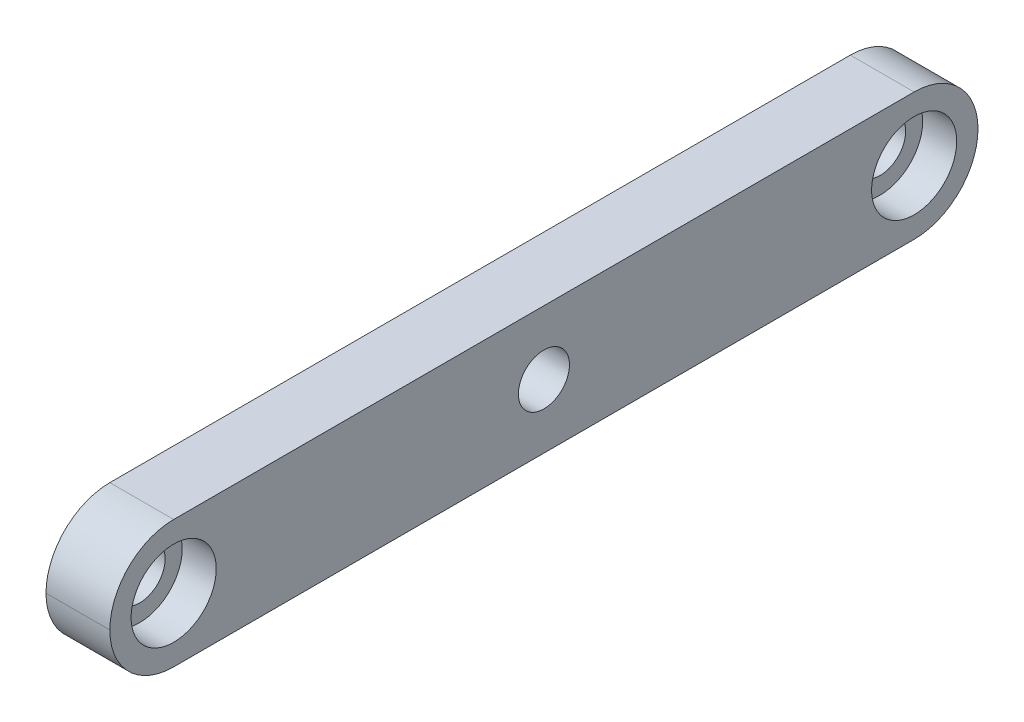
ISO-10303-21;
HEADER;
FILE_DESCRIPTION(('STEP AP214'),'2;1');
FILE_NAME('part.step','',(''),(''),'','','');
FILE_SCHEMA(('AUTOMOTIVE_DESIGN { 1 0 10303 214 1 1 1 1 }'));
ENDSEC;
DATA;
#1=APPLICATION_CONTEXT('core data for automotive mechanical design processes');
#2=APPLICATION_PROTOCOL_DEFINITION('international standard','automotive_design',2000,#1);
#3=PRODUCT_CONTEXT('',#1,'mechanical');
#4=PRODUCT('Part','Part','',(#3));
#5=PRODUCT_RELATED_PRODUCT_CATEGORY('part','',(#4));
#6=PRODUCT_DEFINITION_FORMATION('','',#4);
#7=PRODUCT_DEFINITION_CONTEXT('part definition',#1,'design');
#8=PRODUCT_DEFINITION('design','',#6,#7);
#9=PRODUCT_DEFINITION_SHAPE('','',#8);
#10=(LENGTH_UNIT() NAMED_UNIT(*) SI_UNIT(.MILLI.,.METRE.));
#11=(NAMED_UNIT(*) PLANE_ANGLE_UNIT() SI_UNIT($,.RADIAN.));
#12=(NAMED_UNIT(*) SI_UNIT($,.STERADIAN.) SOLID_ANGLE_UNIT());
#13=UNCERTAINTY_MEASURE_WITH_UNIT(LENGTH_MEASURE(1.E-05),#10,'distance_accuracy_value','');
#14=(GEOMETRIC_REPRESENTATION_CONTEXT(3) GLOBAL_UNCERTAINTY_ASSIGNED_CONTEXT((#13)) GLOBAL_UNIT_ASSIGNED_CONTEXT((#10,
#11,#12)) REPRESENTATION_CONTEXT('',''));
#15=CARTESIAN_POINT('',(0.,0.,0.));
#16=DIRECTION('',(0.,0.,1.));
#17=DIRECTION('',(1.,0.,0.));
#18=AXIS2_PLACEMENT_3D('',#15,#16,#17);
#19=CARTESIAN_POINT('',(1.5,0.,8.7));
#20=DIRECTION('',(-1.,0.,0.));
#21=DIRECTION('',(0.,0.,1.));
#22=AXIS2_PLACEMENT_3D('',#19,#20,#21);
#23=CYLINDRICAL_SURFACE('',#22,0.6);
#24=CARTESIAN_POINT('',(0.,0.,8.7));
#25=DIRECTION('',(1.,0.,0.));
#26=DIRECTION('',(0.,0.,-1.));
#27=AXIS2_PLACEMENT_3D('',#24,#25,#26);
#28=CIRCLE('',#27,0.6);
#29=CARTESIAN_POINT('',(0.,0.,8.1));
#30=VERTEX_POINT('',#29);
#31=EDGE_CURVE('E188',#30,#30,#28,.T.);
#32=ORIENTED_EDGE('',*,*,#31,.F.);
#33=EDGE_LOOP('',(#32));
#34=FACE_BOUND('',#33,.T.);
#35=CARTESIAN_POINT('',(0.7,0.,8.7));
#36=DIRECTION('',(1.,0.,0.));
#37=DIRECTION('',(0.,0.,-1.));
#38=AXIS2_PLACEMENT_3D('',#35,#36,#37);
#39=CIRCLE('',#38,0.6);
#40=CARTESIAN_POINT('',(0.7,0.,8.1));
#41=VERTEX_POINT('',#40);
#42=EDGE_CURVE('E85',#41,#41,#39,.T.);
#43=ORIENTED_EDGE('',*,*,#42,.T.);
#44=EDGE_LOOP('',(#43));
#45=FACE_BOUND('',#44,.T.);
#46=ADVANCED_FACE('F81',(#34,#45),#23,.F.);
#47=CARTESIAN_POINT('',(1.5,0.,-8.7));
#48=DIRECTION('',(-1.,0.,0.));
#49=DIRECTION('',(0.,0.,1.));
#50=AXIS2_PLACEMENT_3D('',#47,#48,#49);
#51=CYLINDRICAL_SURFACE('',#50,0.6);
#52=CARTESIAN_POINT('',(0.,0.,-8.7));
#53=DIRECTION('',(1.,0.,0.));
#54=DIRECTION('',(0.,0.,-1.));
#55=AXIS2_PLACEMENT_3D('',#52,#53,#54);
#56=CIRCLE('',#55,0.6);
#57=CARTESIAN_POINT('',(0.,0.,-9.3));
#58=VERTEX_POINT('',#57);
#59=EDGE_CURVE('E160',#58,#58,#56,.T.);
#60=ORIENTED_EDGE('',*,*,#59,.F.);
#61=EDGE_LOOP('',(#60));
#62=FACE_BOUND('',#61,.T.);
#63=CARTESIAN_POINT('',(0.7,0.,-8.7));
#64=DIRECTION('',(1.,0.,0.));
#65=DIRECTION('',(0.,0.,-1.));
#66=AXIS2_PLACEMENT_3D('',#63,#64,#65);
#67=CIRCLE('',#66,0.6);
#68=CARTESIAN_POINT('',(0.7,0.,-9.3));
#69=VERTEX_POINT('',#68);
#70=EDGE_CURVE('E163',#69,#69,#67,.T.);
#71=ORIENTED_EDGE('',*,*,#70,.T.);
#72=EDGE_LOOP('',(#71));
#73=FACE_BOUND('',#72,.T.);
#74=ADVANCED_FACE('F239',(#62,#73),#51,.F.);
#75=CARTESIAN_POINT('',(1.5,0.,0.));
#76=DIRECTION('',(1.,0.,0.));
#77=DIRECTION('',(0.,0.,-1.));
#78=AXIS2_PLACEMENT_3D('',#75,#76,#77);
#79=PLANE('',#78);
#80=CARTESIAN_POINT('',(1.5,0.,8.7));
#81=DIRECTION('',(1.,0.,0.));
#82=DIRECTION('',(0.,0.,-1.));
#83=AXIS2_PLACEMENT_3D('',#80,#81,#82);
#84=CIRCLE('',#83,1.);
#85=CARTESIAN_POINT('',(1.5,0.,7.7));
#86=VERTEX_POINT('',#85);
#87=EDGE_CURVE('E169',#86,#86,#84,.T.);
#88=ORIENTED_EDGE('',*,*,#87,.F.);
#89=EDGE_LOOP('',(#88));
#90=FACE_BOUND('',#89,.T.);
#91=CARTESIAN_POINT('',(1.5,0.,-8.7));
#92=DIRECTION('',(1.,0.,0.));
#93=DIRECTION('',(0.,0.,-1.));
#94=AXIS2_PLACEMENT_3D('',#91,#92,#93);
#95=CIRCLE('',#94,1.);
#96=CARTESIAN_POINT('',(1.5,0.,-9.7));
#97=VERTEX_POINT('',#96);
#98=EDGE_CURVE('E174',#97,#97,#95,.T.);
#99=ORIENTED_EDGE('',*,*,#98,.F.);
#100=EDGE_LOOP('',(#99));
#101=FACE_BOUND('',#100,.T.);
#102=CARTESIAN_POINT('',(1.5,0.,0.));
#103=DIRECTION('',(1.,0.,0.));
#104=DIRECTION('',(0.,0.,-1.));
#105=AXIS2_PLACEMENT_3D('',#102,#103,#104);
#106=CIRCLE('',#105,0.6);
#107=CARTESIAN_POINT('',(1.5,0.,-0.6));
#108=VERTEX_POINT('',#107);
#109=EDGE_CURVE('E185',#108,#108,#106,.T.);
#110=ORIENTED_EDGE('',*,*,#109,.F.);
#111=EDGE_LOOP('',(#110));
#112=FACE_BOUND('',#111,.T.);
#113=DIRECTION('',(0.,0.,-1.));
#114=VECTOR('',#113,1.);
#115=CARTESIAN_POINT('',(1.5,-1.5,10.2));
#116=LINE('',#115,#114);
#117=CARTESIAN_POINT('',(1.5,-1.5,8.7));
#118=VERTEX_POINT('',#117);
#119=CARTESIAN_POINT('',(1.5,-1.5,-8.7));
#120=VERTEX_POINT('',#119);
#121=EDGE_CURVE('E193',#118,#120,#116,.T.);
#122=ORIENTED_EDGE('',*,*,#121,.T.);
#123=CARTESIAN_POINT('',(1.5,0.,-8.7));
#124=DIRECTION('',(1.,0.,0.));
#125=DIRECTION('',(0.,0.,-1.));
#126=AXIS2_PLACEMENT_3D('',#123,#124,#125);
#127=CIRCLE('',#126,1.5);
#128=CARTESIAN_POINT('',(1.5,0.,-10.2));
#129=VERTEX_POINT('',#128);
#130=EDGE_CURVE('E212',#120,#129,#127,.T.);
#131=ORIENTED_EDGE('',*,*,#130,.T.);
#132=CARTESIAN_POINT('',(1.5,0.,-8.7));
#133=DIRECTION('',(1.,0.,0.));
#134=DIRECTION('',(0.,0.,-1.));
#135=AXIS2_PLACEMENT_3D('',#132,#133,#134);
#136=CIRCLE('',#135,1.5);
#137=CARTESIAN_POINT('',(1.5,1.5,-8.7));
#138=VERTEX_POINT('',#137);
#139=EDGE_CURVE('E98',#129,#138,#136,.T.);
#140=ORIENTED_EDGE('',*,*,#139,.T.);
#141=DIRECTION('',(0.,0.,-1.));
#142=VECTOR('',#141,1.);
#143=CARTESIAN_POINT('',(1.5,1.5,10.2));
#144=LINE('',#143,#142);
#145=CARTESIAN_POINT('',(1.5,1.5,8.7));
#146=VERTEX_POINT('',#145);
#147=EDGE_CURVE('E153',#146,#138,#144,.T.);
#148=ORIENTED_EDGE('',*,*,#147,.F.);
#149=CARTESIAN_POINT('',(1.5,0.,8.7));
#150=DIRECTION('',(1.,0.,0.));
#151=DIRECTION('',(0.,0.,-1.));
#152=AXIS2_PLACEMENT_3D('',#149,#150,#151);
#153=CIRCLE('',#152,1.5);
#154=CARTESIAN_POINT('',(1.5,0.,10.2));
#155=VERTEX_POINT('',#154);
#156=EDGE_CURVE('E208',#146,#155,#153,.T.);
#157=ORIENTED_EDGE('',*,*,#156,.T.);
#158=CARTESIAN_POINT('',(1.5,0.,8.7));
#159=DIRECTION('',(1.,0.,0.));
#160=DIRECTION('',(0.,0.,-1.));
#161=AXIS2_PLACEMENT_3D('',#158,#159,#160);
#162=CIRCLE('',#161,1.5);
#163=EDGE_CURVE('E156',#155,#118,#162,.T.);
#164=ORIENTED_EDGE('',*,*,#163,.T.);
#165=EDGE_LOOP('',(#122,#131,#140,#148,#157,#164));
#166=FACE_BOUND('',#165,.T.);
#167=ADVANCED_FACE('F214',(#90,#101,#112,#166),#79,.T.);
#168=CARTESIAN_POINT('',(0.,0.,0.));
#169=DIRECTION('',(1.,0.,0.));
#170=DIRECTION('',(0.,0.,-1.));
#171=AXIS2_PLACEMENT_3D('',#168,#169,#170);
#172=PLANE('',#171);
#173=CARTESIAN_POINT('',(0.,0.,-8.7));
#174=DIRECTION('',(1.,0.,0.));
#175=DIRECTION('',(0.,0.,-1.));
#176=AXIS2_PLACEMENT_3D('',#173,#174,#175);
#177=CIRCLE('',#176,1.5);
#178=CARTESIAN_POINT('',(0.,1.5,-8.7));
#179=VERTEX_POINT('',#178);
#180=CARTESIAN_POINT('',(0.,0.,-10.2));
#181=VERTEX_POINT('',#180);
#182=EDGE_CURVE('E146',#179,#181,#177,.F.);
#183=ORIENTED_EDGE('',*,*,#182,.T.);
#184=CARTESIAN_POINT('',(0.,0.,-8.7));
#185=DIRECTION('',(1.,0.,0.));
#186=DIRECTION('',(0.,0.,-1.));
#187=AXIS2_PLACEMENT_3D('',#184,#185,#186);
#188=CIRCLE('',#187,1.5);
#189=CARTESIAN_POINT('',(0.,-1.5,-8.7));
#190=VERTEX_POINT('',#189);
#191=EDGE_CURVE('E201',#181,#190,#188,.F.);
#192=ORIENTED_EDGE('',*,*,#191,.T.);
#193=DIRECTION('',(0.,0.,-1.));
#194=VECTOR('',#193,1.);
#195=CARTESIAN_POINT('',(0.,-1.5,10.2));
#196=LINE('',#195,#194);
#197=CARTESIAN_POINT('',(0.,-1.5,8.7));
#198=VERTEX_POINT('',#197);
#199=EDGE_CURVE('E141',#198,#190,#196,.T.);
#200=ORIENTED_EDGE('',*,*,#199,.F.);
#201=CARTESIAN_POINT('',(0.,0.,8.7));
#202=DIRECTION('',(1.,0.,0.));
#203=DIRECTION('',(0.,0.,-1.));
#204=AXIS2_PLACEMENT_3D('',#201,#202,#203);
#205=CIRCLE('',#204,1.5);
#206=CARTESIAN_POINT('',(0.,0.,10.2));
#207=VERTEX_POINT('',#206);
#208=EDGE_CURVE('E134',#198,#207,#205,.F.);
#209=ORIENTED_EDGE('',*,*,#208,.T.);
#210=CARTESIAN_POINT('',(0.,0.,8.7));
#211=DIRECTION('',(1.,0.,0.));
#212=DIRECTION('',(0.,0.,-1.));
#213=AXIS2_PLACEMENT_3D('',#210,#211,#212);
#214=CIRCLE('',#213,1.5);
#215=CARTESIAN_POINT('',(0.,1.5,8.7));
#216=VERTEX_POINT('',#215);
#217=EDGE_CURVE('E139',#207,#216,#214,.F.);
#218=ORIENTED_EDGE('',*,*,#217,.T.);
#219=DIRECTION('',(0.,0.,-1.));
#220=VECTOR('',#219,1.);
#221=CARTESIAN_POINT('',(0.,1.5,10.2));
#222=LINE('',#221,#220);
#223=EDGE_CURVE('E196',#216,#179,#222,.T.);
#224=ORIENTED_EDGE('',*,*,#223,.T.);
#225=EDGE_LOOP('',(#183,#192,#200,#209,#218,#224));
#226=FACE_BOUND('',#225,.T.);
#227=ORIENTED_EDGE('',*,*,#31,.T.);
#228=EDGE_LOOP('',(#227));
#229=FACE_BOUND('',#228,.T.);
#230=CARTESIAN_POINT('',(0.,0.,0.));
#231=DIRECTION('',(1.,0.,0.));
#232=DIRECTION('',(0.,0.,-1.));
#233=AXIS2_PLACEMENT_3D('',#230,#231,#232);
#234=CIRCLE('',#233,0.6);
#235=CARTESIAN_POINT('',(0.,0.,-0.6));
#236=VERTEX_POINT('',#235);
#237=EDGE_CURVE('E184',#236,#236,#234,.T.);
#238=ORIENTED_EDGE('',*,*,#237,.T.);
#239=EDGE_LOOP('',(#238));
#240=FACE_BOUND('',#239,.T.);
#241=ORIENTED_EDGE('',*,*,#59,.T.);
#242=EDGE_LOOP('',(#241));
#243=FACE_BOUND('',#242,.T.);
#244=ADVANCED_FACE('F136',(#226,#229,#240,#243),#172,.F.);
#245=CARTESIAN_POINT('',(1.5,-1.5,10.2));
#246=DIRECTION('',(0.,1.,0.));
#247=DIRECTION('',(0.,0.,1.));
#248=AXIS2_PLACEMENT_3D('',#245,#246,#247);
#249=PLANE('',#248);
#250=ORIENTED_EDGE('',*,*,#199,.T.);
#251=DIRECTION('',(-1.,0.,0.));
#252=VECTOR('',#251,1.);
#253=CARTESIAN_POINT('',(1.5,-1.5,-8.7));
#254=LINE('',#253,#252);
#255=EDGE_CURVE('E205',#190,#120,#254,.F.);
#256=ORIENTED_EDGE('',*,*,#255,.T.);
#257=ORIENTED_EDGE('',*,*,#121,.F.);
#258=DIRECTION('',(-1.,0.,0.));
#259=VECTOR('',#258,1.);
#260=CARTESIAN_POINT('',(1.5,-1.5,8.7));
#261=LINE('',#260,#259);
#262=EDGE_CURVE('E203',#118,#198,#261,.T.);
#263=ORIENTED_EDGE('',*,*,#262,.T.);
#264=EDGE_LOOP('',(#250,#256,#257,#263));
#265=FACE_BOUND('',#264,.T.);
#266=ADVANCED_FACE('F226',(#265),#249,.F.);
#267=CARTESIAN_POINT('',(1.5,1.5,10.2));
#268=DIRECTION('',(0.,1.,0.));
#269=DIRECTION('',(0.,0.,1.));
#270=AXIS2_PLACEMENT_3D('',#267,#268,#269);
#271=PLANE('',#270);
#272=ORIENTED_EDGE('',*,*,#147,.T.);
#273=DIRECTION('',(-1.,0.,0.));
#274=VECTOR('',#273,1.);
#275=CARTESIAN_POINT('',(1.5,1.5,-8.7));
#276=LINE('',#275,#274);
#277=EDGE_CURVE('E12',#138,#179,#276,.T.);
#278=ORIENTED_EDGE('',*,*,#277,.T.);
#279=ORIENTED_EDGE('',*,*,#223,.F.);
#280=DIRECTION('',(-1.,0.,0.));
#281=VECTOR('',#280,1.);
#282=CARTESIAN_POINT('',(1.5,1.5,8.7));
#283=LINE('',#282,#281);
#284=EDGE_CURVE('E90',#216,#146,#283,.F.);
#285=ORIENTED_EDGE('',*,*,#284,.T.);
#286=EDGE_LOOP('',(#272,#278,#279,#285));
#287=FACE_BOUND('',#286,.T.);
#288=ADVANCED_FACE('F228',(#287),#271,.T.);
#289=CARTESIAN_POINT('',(1.5,0.,0.));
#290=DIRECTION('',(-1.,0.,0.));
#291=DIRECTION('',(0.,0.,1.));
#292=AXIS2_PLACEMENT_3D('',#289,#290,#291);
#293=CYLINDRICAL_SURFACE('',#292,0.6);
#294=ORIENTED_EDGE('',*,*,#109,.T.);
#295=EDGE_LOOP('',(#294));
#296=FACE_BOUND('',#295,.T.);
#297=ORIENTED_EDGE('',*,*,#237,.F.);
#298=EDGE_LOOP('',(#297));
#299=FACE_BOUND('',#298,.T.);
#300=ADVANCED_FACE('F234',(#296,#299),#293,.F.);
#301=CARTESIAN_POINT('',(1.5,0.,-8.7));
#302=DIRECTION('',(-1.,0.,0.));
#303=DIRECTION('',(0.,0.,1.));
#304=AXIS2_PLACEMENT_3D('',#301,#302,#303);
#305=CYLINDRICAL_SURFACE('',#304,1.5);
#306=ORIENTED_EDGE('',*,*,#277,.F.);
#307=ORIENTED_EDGE('',*,*,#139,.F.);
#308=DIRECTION('',(-1.,0.,0.));
#309=VECTOR('',#308,1.);
#310=CARTESIAN_POINT('',(1.5,0.,-10.2));
#311=LINE('',#310,#309);
#312=EDGE_CURVE('E157',#181,#129,#311,.F.);
#313=ORIENTED_EDGE('',*,*,#312,.F.);
#314=ORIENTED_EDGE('',*,*,#182,.F.);
#315=EDGE_LOOP('',(#306,#307,#313,#314));
#316=FACE_BOUND('',#315,.T.);
#317=ADVANCED_FACE('F221',(#316),#305,.T.);
#318=CARTESIAN_POINT('',(1.5,0.,-8.7));
#319=DIRECTION('',(1.,0.,0.));
#320=DIRECTION('',(0.,0.,-1.));
#321=AXIS2_PLACEMENT_3D('',#318,#319,#320);
#322=CYLINDRICAL_SURFACE('',#321,1.5);
#323=ORIENTED_EDGE('',*,*,#130,.F.);
#324=ORIENTED_EDGE('',*,*,#255,.F.);
#325=ORIENTED_EDGE('',*,*,#191,.F.);
#326=ORIENTED_EDGE('',*,*,#312,.T.);
#327=EDGE_LOOP('',(#323,#324,#325,#326));
#328=FACE_BOUND('',#327,.T.);
#329=ADVANCED_FACE('F224',(#328),#322,.T.);
#330=CARTESIAN_POINT('',(1.5,0.,8.7));
#331=DIRECTION('',(1.,0.,0.));
#332=DIRECTION('',(0.,0.,-1.));
#333=AXIS2_PLACEMENT_3D('',#330,#331,#332);
#334=CYLINDRICAL_SURFACE('',#333,1.5);
#335=DIRECTION('',(-1.,0.,0.));
#336=VECTOR('',#335,1.);
#337=CARTESIAN_POINT('',(0.,0.,10.2));
#338=LINE('',#337,#336);
#339=EDGE_CURVE('E151',#155,#207,#338,.T.);
#340=ORIENTED_EDGE('',*,*,#339,.F.);
#341=ORIENTED_EDGE('',*,*,#156,.F.);
#342=ORIENTED_EDGE('',*,*,#284,.F.);
#343=ORIENTED_EDGE('',*,*,#217,.F.);
#344=EDGE_LOOP('',(#340,#341,#342,#343));
#345=FACE_BOUND('',#344,.T.);
#346=ADVANCED_FACE('F83',(#345),#334,.T.);
#347=CARTESIAN_POINT('',(1.5,0.,8.7));
#348=DIRECTION('',(-1.,0.,0.));
#349=DIRECTION('',(0.,0.,1.));
#350=AXIS2_PLACEMENT_3D('',#347,#348,#349);
#351=CYLINDRICAL_SURFACE('',#350,1.5);
#352=ORIENTED_EDGE('',*,*,#163,.F.);
#353=ORIENTED_EDGE('',*,*,#339,.T.);
#354=ORIENTED_EDGE('',*,*,#208,.F.);
#355=ORIENTED_EDGE('',*,*,#262,.F.);
#356=EDGE_LOOP('',(#352,#353,#354,#355));
#357=FACE_BOUND('',#356,.T.);
#358=ADVANCED_FACE('F155',(#357),#351,.T.);
#359=CARTESIAN_POINT('',(0.7,0.,-8.7));
#360=DIRECTION('',(1.,0.,0.));
#361=DIRECTION('',(0.,0.,-1.));
#362=AXIS2_PLACEMENT_3D('',#359,#360,#361);
#363=CYLINDRICAL_SURFACE('',#362,1.);
#364=CARTESIAN_POINT('',(0.7,0.,-8.7));
#365=DIRECTION('',(1.,0.,0.));
#366=DIRECTION('',(0.,0.,-1.));
#367=AXIS2_PLACEMENT_3D('',#364,#365,#366);
#368=CIRCLE('',#367,1.);
#369=CARTESIAN_POINT('',(0.7,0.,-9.7));
#370=VERTEX_POINT('',#369);
#371=EDGE_CURVE('E179',#370,#370,#368,.T.);
#372=ORIENTED_EDGE('',*,*,#371,.F.);
#373=EDGE_LOOP('',(#372));
#374=FACE_BOUND('',#373,.T.);
#375=ORIENTED_EDGE('',*,*,#98,.T.);
#376=EDGE_LOOP('',(#375));
#377=FACE_BOUND('',#376,.T.);
#378=ADVANCED_FACE('F275',(#374,#377),#363,.F.);
#379=CARTESIAN_POINT('',(0.7,0.,-8.7));
#380=DIRECTION('',(1.,0.,0.));
#381=DIRECTION('',(0.,0.,-1.));
#382=AXIS2_PLACEMENT_3D('',#379,#380,#381);
#383=PLANE('',#382);
#384=ORIENTED_EDGE('',*,*,#70,.F.);
#385=EDGE_LOOP('',(#384));
#386=FACE_BOUND('',#385,.T.);
#387=ORIENTED_EDGE('',*,*,#371,.T.);
#388=EDGE_LOOP('',(#387));
#389=FACE_BOUND('',#388,.T.);
#390=ADVANCED_FACE('F280',(#386,#389),#383,.T.);
#391=CARTESIAN_POINT('',(0.7,0.,8.7));
#392=DIRECTION('',(1.,0.,0.));
#393=DIRECTION('',(0.,0.,-1.));
#394=AXIS2_PLACEMENT_3D('',#391,#392,#393);
#395=CYLINDRICAL_SURFACE('',#394,1.);
#396=CARTESIAN_POINT('',(0.7,0.,8.7));
#397=DIRECTION('',(1.,0.,0.));
#398=DIRECTION('',(0.,0.,-1.));
#399=AXIS2_PLACEMENT_3D('',#396,#397,#398);
#400=CIRCLE('',#399,1.);
#401=CARTESIAN_POINT('',(0.7,0.,7.7));
#402=VERTEX_POINT('',#401);
#403=EDGE_CURVE('E165',#402,#402,#400,.T.);
#404=ORIENTED_EDGE('',*,*,#403,.F.);
#405=EDGE_LOOP('',(#404));
#406=FACE_BOUND('',#405,.T.);
#407=ORIENTED_EDGE('',*,*,#87,.T.);
#408=EDGE_LOOP('',(#407));
#409=FACE_BOUND('',#408,.T.);
#410=ADVANCED_FACE('F336',(#406,#409),#395,.F.);
#411=CARTESIAN_POINT('',(0.7,0.,8.7));
#412=DIRECTION('',(1.,0.,0.));
#413=DIRECTION('',(0.,0.,-1.));
#414=AXIS2_PLACEMENT_3D('',#411,#412,#413);
#415=PLANE('',#414);
#416=ORIENTED_EDGE('',*,*,#42,.F.);
#417=EDGE_LOOP('',(#416));
#418=FACE_BOUND('',#417,.T.);
#419=ORIENTED_EDGE('',*,*,#403,.T.);
#420=EDGE_LOOP('',(#419));
#421=FACE_BOUND('',#420,.T.);
#422=ADVANCED_FACE('F346',(#418,#421),#415,.T.);
#423=CLOSED_SHELL('',(#46,#74,#167,#244,#266,#288,#300,#317,#329,#346,#358,#378,#390,#410,#422));
#424=MANIFOLD_SOLID_BREP('B2',#423);
#425=ADVANCED_BREP_SHAPE_REPRESENTATION('',(#18,#424),#14);
#426=SHAPE_DEFINITION_REPRESENTATION(#9,#425);
ENDSEC;
END-ISO-10303-21;
